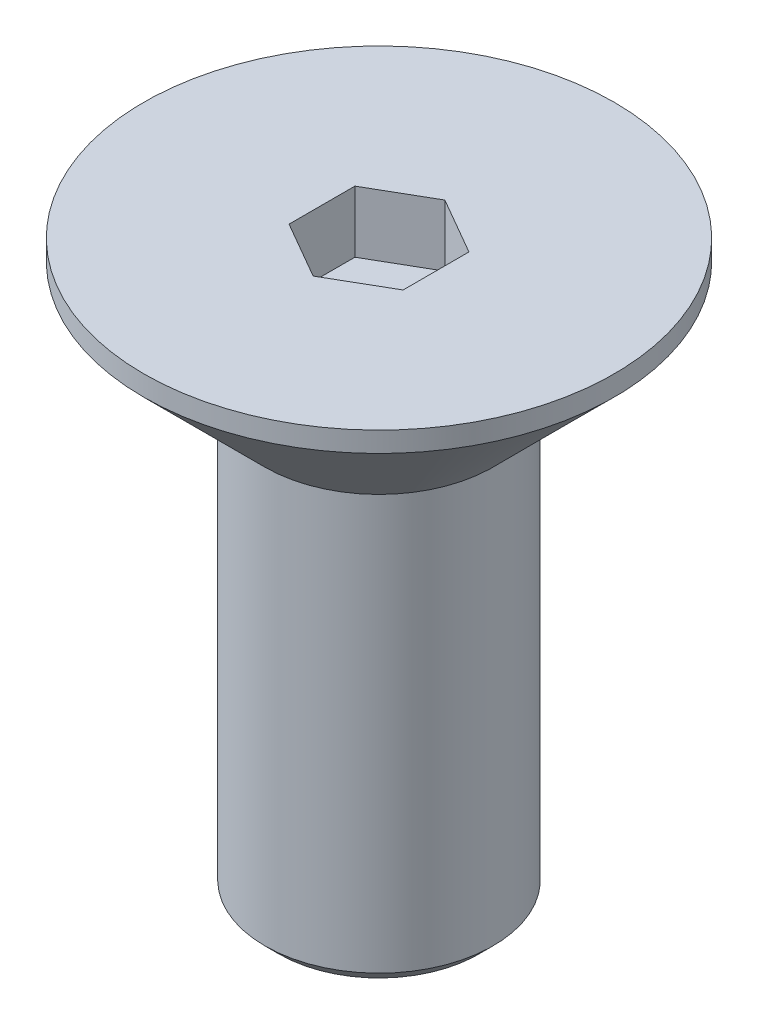
ISO-10303-21;
HEADER;
FILE_DESCRIPTION(('STEP AP214'),'2;1');
FILE_NAME('part.step','',(''),(''),'','','');
FILE_SCHEMA(('AUTOMOTIVE_DESIGN { 1 0 10303 214 1 1 1 1 }'));
ENDSEC;
DATA;
#1=APPLICATION_CONTEXT('core data for automotive mechanical design processes');
#2=APPLICATION_PROTOCOL_DEFINITION('international standard','automotive_design',2000,#1);
#3=PRODUCT_CONTEXT('',#1,'mechanical');
#4=PRODUCT('Part','Part','',(#3));
#5=PRODUCT_RELATED_PRODUCT_CATEGORY('part','',(#4));
#6=PRODUCT_DEFINITION_FORMATION('','',#4);
#7=PRODUCT_DEFINITION_CONTEXT('part definition',#1,'design');
#8=PRODUCT_DEFINITION('design','',#6,#7);
#9=PRODUCT_DEFINITION_SHAPE('','',#8);
#10=(LENGTH_UNIT() NAMED_UNIT(*) SI_UNIT(.MILLI.,.METRE.));
#11=(NAMED_UNIT(*) PLANE_ANGLE_UNIT() SI_UNIT($,.RADIAN.));
#12=(NAMED_UNIT(*) SI_UNIT($,.STERADIAN.) SOLID_ANGLE_UNIT());
#13=UNCERTAINTY_MEASURE_WITH_UNIT(LENGTH_MEASURE(1.E-05),#10,'distance_accuracy_value','');
#14=(GEOMETRIC_REPRESENTATION_CONTEXT(3) GLOBAL_UNCERTAINTY_ASSIGNED_CONTEXT((#13)) GLOBAL_UNIT_ASSIGNED_CONTEXT((#10,
#11,#12)) REPRESENTATION_CONTEXT('',''));
#15=CARTESIAN_POINT('',(0.,0.,0.));
#16=DIRECTION('',(0.,0.,1.));
#17=DIRECTION('',(1.,0.,0.));
#18=AXIS2_PLACEMENT_3D('',#15,#16,#17);
#19=CARTESIAN_POINT('',(0.,0.,0.));
#20=DIRECTION('',(0.,-1.,0.));
#21=DIRECTION('',(0.,0.,-1.));
#22=AXIS2_PLACEMENT_3D('',#19,#20,#21);
#23=PLANE('',#22);
#24=DIRECTION('',(0.,0.,1.));
#25=VECTOR('',#24,1.);
#26=CARTESIAN_POINT('',(-2.,0.,1.15470053837925));
#27=LINE('',#26,#25);
#28=CARTESIAN_POINT('',(-2.,0.,-1.15470053837925));
#29=VERTEX_POINT('',#28);
#30=CARTESIAN_POINT('',(-2.,0.,1.15470053837925));
#31=VERTEX_POINT('',#30);
#32=EDGE_CURVE('E141',#29,#31,#27,.T.);
#33=ORIENTED_EDGE('',*,*,#32,.F.);
#34=DIRECTION('',(-0.866025403784439,0.,0.5));
#35=VECTOR('',#34,1.);
#36=CARTESIAN_POINT('',(-2.,0.,-1.15470053837925));
#37=LINE('',#36,#35);
#38=CARTESIAN_POINT('',(0.,0.,-2.3094010767585));
#39=VERTEX_POINT('',#38);
#40=EDGE_CURVE('E67',#39,#29,#37,.T.);
#41=ORIENTED_EDGE('',*,*,#40,.F.);
#42=DIRECTION('',(-0.866025403784439,0.,-0.5));
#43=VECTOR('',#42,1.);
#44=CARTESIAN_POINT('',(0.,0.,-2.3094010767585));
#45=LINE('',#44,#43);
#46=CARTESIAN_POINT('',(2.,0.,-1.15470053837925));
#47=VERTEX_POINT('',#46);
#48=EDGE_CURVE('E150',#47,#39,#45,.T.);
#49=ORIENTED_EDGE('',*,*,#48,.F.);
#50=DIRECTION('',(0.,0.,-1.));
#51=VECTOR('',#50,1.);
#52=CARTESIAN_POINT('',(2.,0.,-1.15470053837925));
#53=LINE('',#52,#51);
#54=CARTESIAN_POINT('',(2.,0.,1.15470053837925));
#55=VERTEX_POINT('',#54);
#56=EDGE_CURVE('E148',#55,#47,#53,.T.);
#57=ORIENTED_EDGE('',*,*,#56,.F.);
#58=DIRECTION('',(0.866025403784439,0.,-0.5));
#59=VECTOR('',#58,1.);
#60=CARTESIAN_POINT('',(2.,0.,1.15470053837925));
#61=LINE('',#60,#59);
#62=CARTESIAN_POINT('',(0.,0.,2.3094010767585));
#63=VERTEX_POINT('',#62);
#64=EDGE_CURVE('E115',#63,#55,#61,.T.);
#65=ORIENTED_EDGE('',*,*,#64,.F.);
#66=DIRECTION('',(0.866025403784439,0.,0.5));
#67=VECTOR('',#66,1.);
#68=CARTESIAN_POINT('',(0.,0.,2.3094010767585));
#69=LINE('',#68,#67);
#70=EDGE_CURVE('E144',#31,#63,#69,.T.);
#71=ORIENTED_EDGE('',*,*,#70,.F.);
#72=EDGE_LOOP('',(#33,#41,#49,#57,#65,#71));
#73=FACE_BOUND('',#72,.T.);
#74=CARTESIAN_POINT('',(0.,0.,0.));
#75=DIRECTION('',(0.,1.,0.));
#76=DIRECTION('',(0.,0.,1.));
#77=AXIS2_PLACEMENT_3D('',#74,#75,#76);
#78=CIRCLE('',#77,8.25);
#79=CARTESIAN_POINT('',(0.,0.,8.25));
#80=VERTEX_POINT('',#79);
#81=EDGE_CURVE('E165',#80,#80,#78,.T.);
#82=ORIENTED_EDGE('',*,*,#81,.T.);
#83=EDGE_LOOP('',(#82));
#84=FACE_BOUND('',#83,.T.);
#85=ADVANCED_FACE('F51',(#73,#84),#23,.F.);
#86=CARTESIAN_POINT('',(0.,0.,0.));
#87=DIRECTION('',(0.,1.,0.));
#88=DIRECTION('',(0.,0.,1.));
#89=AXIS2_PLACEMENT_3D('',#86,#87,#88);
#90=CYLINDRICAL_SURFACE('',#89,8.25);
#91=ORIENTED_EDGE('',*,*,#81,.F.);
#92=EDGE_LOOP('',(#91));
#93=FACE_BOUND('',#92,.T.);
#94=CARTESIAN_POINT('',(0.,-0.709999999999982,0.));
#95=DIRECTION('',(0.,1.,0.));
#96=DIRECTION('',(0.,0.,1.));
#97=AXIS2_PLACEMENT_3D('',#94,#95,#96);
#98=CIRCLE('',#97,8.25);
#99=CARTESIAN_POINT('',(0.,-0.709999999999982,8.25));
#100=VERTEX_POINT('',#99);
#101=EDGE_CURVE('E162',#100,#100,#98,.T.);
#102=ORIENTED_EDGE('',*,*,#101,.T.);
#103=EDGE_LOOP('',(#102));
#104=FACE_BOUND('',#103,.T.);
#105=ADVANCED_FACE('F183',(#93,#104),#90,.T.);
#106=CARTESIAN_POINT('',(0.,-4.96,0.));
#107=DIRECTION('',(0.,1.,0.));
#108=DIRECTION('',(0.,0.,1.));
#109=AXIS2_PLACEMENT_3D('',#106,#107,#108);
#110=CONICAL_SURFACE('',#109,4.,0.785398163397446);
#111=ORIENTED_EDGE('',*,*,#101,.F.);
#112=EDGE_LOOP('',(#111));
#113=FACE_BOUND('',#112,.T.);
#114=CARTESIAN_POINT('',(0.,-4.96,0.));
#115=DIRECTION('',(0.,1.,0.));
#116=DIRECTION('',(0.,0.,1.));
#117=AXIS2_PLACEMENT_3D('',#114,#115,#116);
#118=CIRCLE('',#117,4.);
#119=CARTESIAN_POINT('',(0.,-4.96,4.));
#120=VERTEX_POINT('',#119);
#121=EDGE_CURVE('E154',#120,#120,#118,.T.);
#122=ORIENTED_EDGE('',*,*,#121,.T.);
#123=EDGE_LOOP('',(#122));
#124=FACE_BOUND('',#123,.T.);
#125=ADVANCED_FACE('F190',(#113,#124),#110,.T.);
#126=CARTESIAN_POINT('',(0.,0.,0.));
#127=DIRECTION('',(0.,1.,0.));
#128=DIRECTION('',(0.,0.,1.));
#129=AXIS2_PLACEMENT_3D('',#126,#127,#128);
#130=CYLINDRICAL_SURFACE('',#129,4.);
#131=CARTESIAN_POINT('',(0.,-19.5,0.));
#132=DIRECTION('',(0.,1.,0.));
#133=DIRECTION('',(0.,0.,1.));
#134=AXIS2_PLACEMENT_3D('',#131,#132,#133);
#135=CIRCLE('',#134,4.);
#136=CARTESIAN_POINT('',(0.,-19.5,4.));
#137=VERTEX_POINT('',#136);
#138=EDGE_CURVE('E60',#137,#137,#135,.T.);
#139=ORIENTED_EDGE('',*,*,#138,.T.);
#140=EDGE_LOOP('',(#139));
#141=FACE_BOUND('',#140,.T.);
#142=ORIENTED_EDGE('',*,*,#121,.F.);
#143=EDGE_LOOP('',(#142));
#144=FACE_BOUND('',#143,.T.);
#145=ADVANCED_FACE('F170',(#141,#144),#130,.T.);
#146=CARTESIAN_POINT('',(4.,-20.,0.));
#147=DIRECTION('',(0.,1.,0.));
#148=DIRECTION('',(0.,0.,1.));
#149=AXIS2_PLACEMENT_3D('',#146,#147,#148);
#150=PLANE('',#149);
#151=CARTESIAN_POINT('',(0.,-20.,0.));
#152=DIRECTION('',(0.,1.,0.));
#153=DIRECTION('',(0.,0.,1.));
#154=AXIS2_PLACEMENT_3D('',#151,#152,#153);
#155=CIRCLE('',#154,3.5);
#156=CARTESIAN_POINT('',(0.,-20.,3.5));
#157=VERTEX_POINT('',#156);
#158=EDGE_CURVE('E11',#157,#157,#155,.F.);
#159=ORIENTED_EDGE('',*,*,#158,.T.);
#160=EDGE_LOOP('',(#159));
#161=FACE_BOUND('',#160,.T.);
#162=ADVANCED_FACE('F200',(#161),#150,.F.);
#163=CARTESIAN_POINT('',(-2.,-2.16,-1.15470053837925));
#164=DIRECTION('',(-0.5,0.,-0.866025403784439));
#165=DIRECTION('',(-0.866025403784439,0.,0.5));
#166=AXIS2_PLACEMENT_3D('',#163,#164,#165);
#167=PLANE('',#166);
#168=ORIENTED_EDGE('',*,*,#40,.T.);
#169=DIRECTION('',(0.,1.,0.));
#170=VECTOR('',#169,1.);
#171=CARTESIAN_POINT('',(-2.,-2.16,-1.15470053837925));
#172=LINE('',#171,#170);
#173=CARTESIAN_POINT('',(-2.,-2.16,-1.15470053837925));
#174=VERTEX_POINT('',#173);
#175=EDGE_CURVE('E97',#174,#29,#172,.T.);
#176=ORIENTED_EDGE('',*,*,#175,.F.);
#177=DIRECTION('',(-0.866025403784439,0.,0.5));
#178=VECTOR('',#177,1.);
#179=CARTESIAN_POINT('',(-2.,-2.16,-1.15470053837925));
#180=LINE('',#179,#178);
#181=CARTESIAN_POINT('',(0.,-2.16,-2.3094010767585));
#182=VERTEX_POINT('',#181);
#183=EDGE_CURVE('E152',#182,#174,#180,.T.);
#184=ORIENTED_EDGE('',*,*,#183,.F.);
#185=DIRECTION('',(0.,1.,0.));
#186=VECTOR('',#185,1.);
#187=CARTESIAN_POINT('',(0.,-2.16,-2.3094010767585));
#188=LINE('',#187,#186);
#189=EDGE_CURVE('E75',#182,#39,#188,.T.);
#190=ORIENTED_EDGE('',*,*,#189,.T.);
#191=EDGE_LOOP('',(#168,#176,#184,#190));
#192=FACE_BOUND('',#191,.T.);
#193=ADVANCED_FACE('F202',(#192),#167,.F.);
#194=CARTESIAN_POINT('',(0.,-2.16,-2.3094010767585));
#195=DIRECTION('',(0.5,0.,-0.866025403784439));
#196=DIRECTION('',(-0.866025403784439,0.,-0.5));
#197=AXIS2_PLACEMENT_3D('',#194,#195,#196);
#198=PLANE('',#197);
#199=ORIENTED_EDGE('',*,*,#48,.T.);
#200=ORIENTED_EDGE('',*,*,#189,.F.);
#201=DIRECTION('',(-0.866025403784439,0.,-0.5));
#202=VECTOR('',#201,1.);
#203=CARTESIAN_POINT('',(0.,-2.16,-2.3094010767585));
#204=LINE('',#203,#202);
#205=CARTESIAN_POINT('',(2.,-2.16,-1.15470053837925));
#206=VERTEX_POINT('',#205);
#207=EDGE_CURVE('E127',#206,#182,#204,.T.);
#208=ORIENTED_EDGE('',*,*,#207,.F.);
#209=DIRECTION('',(0.,1.,0.));
#210=VECTOR('',#209,1.);
#211=CARTESIAN_POINT('',(2.,-2.16,-1.15470053837925));
#212=LINE('',#211,#210);
#213=EDGE_CURVE('E119',#206,#47,#212,.T.);
#214=ORIENTED_EDGE('',*,*,#213,.T.);
#215=EDGE_LOOP('',(#199,#200,#208,#214));
#216=FACE_BOUND('',#215,.T.);
#217=ADVANCED_FACE('F205',(#216),#198,.F.);
#218=CARTESIAN_POINT('',(2.,-2.16,-1.15470053837925));
#219=DIRECTION('',(1.,0.,0.));
#220=DIRECTION('',(0.,0.,-1.));
#221=AXIS2_PLACEMENT_3D('',#218,#219,#220);
#222=PLANE('',#221);
#223=ORIENTED_EDGE('',*,*,#56,.T.);
#224=ORIENTED_EDGE('',*,*,#213,.F.);
#225=DIRECTION('',(0.,0.,-1.));
#226=VECTOR('',#225,1.);
#227=CARTESIAN_POINT('',(2.,-2.16,-1.15470053837925));
#228=LINE('',#227,#226);
#229=CARTESIAN_POINT('',(2.,-2.16,1.15470053837925));
#230=VERTEX_POINT('',#229);
#231=EDGE_CURVE('E123',#230,#206,#228,.T.);
#232=ORIENTED_EDGE('',*,*,#231,.F.);
#233=DIRECTION('',(0.,1.,0.));
#234=VECTOR('',#233,1.);
#235=CARTESIAN_POINT('',(2.,-2.16,1.15470053837925));
#236=LINE('',#235,#234);
#237=EDGE_CURVE('E108',#230,#55,#236,.T.);
#238=ORIENTED_EDGE('',*,*,#237,.T.);
#239=EDGE_LOOP('',(#223,#224,#232,#238));
#240=FACE_BOUND('',#239,.T.);
#241=ADVANCED_FACE('F124',(#240),#222,.F.);
#242=CARTESIAN_POINT('',(2.,-2.16,1.15470053837925));
#243=DIRECTION('',(0.5,0.,0.866025403784439));
#244=DIRECTION('',(0.866025403784439,0.,-0.5));
#245=AXIS2_PLACEMENT_3D('',#242,#243,#244);
#246=PLANE('',#245);
#247=ORIENTED_EDGE('',*,*,#64,.T.);
#248=ORIENTED_EDGE('',*,*,#237,.F.);
#249=DIRECTION('',(0.866025403784439,0.,-0.5));
#250=VECTOR('',#249,1.);
#251=CARTESIAN_POINT('',(2.,-2.16,1.15470053837925));
#252=LINE('',#251,#250);
#253=CARTESIAN_POINT('',(0.,-2.16,2.3094010767585));
#254=VERTEX_POINT('',#253);
#255=EDGE_CURVE('E112',#254,#230,#252,.T.);
#256=ORIENTED_EDGE('',*,*,#255,.F.);
#257=DIRECTION('',(0.,1.,0.));
#258=VECTOR('',#257,1.);
#259=CARTESIAN_POINT('',(0.,-2.16,2.3094010767585));
#260=LINE('',#259,#258);
#261=EDGE_CURVE('E120',#254,#63,#260,.T.);
#262=ORIENTED_EDGE('',*,*,#261,.T.);
#263=EDGE_LOOP('',(#247,#248,#256,#262));
#264=FACE_BOUND('',#263,.T.);
#265=ADVANCED_FACE('F110',(#264),#246,.F.);
#266=CARTESIAN_POINT('',(0.,-2.16,2.3094010767585));
#267=DIRECTION('',(-0.5,0.,0.866025403784439));
#268=DIRECTION('',(0.866025403784439,0.,0.5));
#269=AXIS2_PLACEMENT_3D('',#266,#267,#268);
#270=PLANE('',#269);
#271=ORIENTED_EDGE('',*,*,#70,.T.);
#272=ORIENTED_EDGE('',*,*,#261,.F.);
#273=DIRECTION('',(0.866025403784439,0.,0.5));
#274=VECTOR('',#273,1.);
#275=CARTESIAN_POINT('',(0.,-2.16,2.3094010767585));
#276=LINE('',#275,#274);
#277=CARTESIAN_POINT('',(-2.,-2.16,1.15470053837925));
#278=VERTEX_POINT('',#277);
#279=EDGE_CURVE('E133',#278,#254,#276,.T.);
#280=ORIENTED_EDGE('',*,*,#279,.F.);
#281=DIRECTION('',(0.,1.,0.));
#282=VECTOR('',#281,1.);
#283=CARTESIAN_POINT('',(-2.,-2.16,1.15470053837925));
#284=LINE('',#283,#282);
#285=EDGE_CURVE('E157',#278,#31,#284,.T.);
#286=ORIENTED_EDGE('',*,*,#285,.T.);
#287=EDGE_LOOP('',(#271,#272,#280,#286));
#288=FACE_BOUND('',#287,.T.);
#289=ADVANCED_FACE('F208',(#288),#270,.F.);
#290=CARTESIAN_POINT('',(-2.,-2.16,1.15470053837925));
#291=DIRECTION('',(-1.,0.,0.));
#292=DIRECTION('',(0.,0.,1.));
#293=AXIS2_PLACEMENT_3D('',#290,#291,#292);
#294=PLANE('',#293);
#295=ORIENTED_EDGE('',*,*,#32,.T.);
#296=ORIENTED_EDGE('',*,*,#285,.F.);
#297=DIRECTION('',(0.,0.,1.));
#298=VECTOR('',#297,1.);
#299=CARTESIAN_POINT('',(-2.,-2.16,1.15470053837925));
#300=LINE('',#299,#298);
#301=EDGE_CURVE('E135',#174,#278,#300,.T.);
#302=ORIENTED_EDGE('',*,*,#301,.F.);
#303=ORIENTED_EDGE('',*,*,#175,.T.);
#304=EDGE_LOOP('',(#295,#296,#302,#303));
#305=FACE_BOUND('',#304,.T.);
#306=ADVANCED_FACE('F179',(#305),#294,.F.);
#307=CARTESIAN_POINT('',(0.,-2.16,0.));
#308=DIRECTION('',(0.,-1.,0.));
#309=DIRECTION('',(0.,0.,-1.));
#310=AXIS2_PLACEMENT_3D('',#307,#308,#309);
#311=PLANE('',#310);
#312=ORIENTED_EDGE('',*,*,#183,.T.);
#313=ORIENTED_EDGE('',*,*,#301,.T.);
#314=ORIENTED_EDGE('',*,*,#279,.T.);
#315=ORIENTED_EDGE('',*,*,#255,.T.);
#316=ORIENTED_EDGE('',*,*,#231,.T.);
#317=ORIENTED_EDGE('',*,*,#207,.T.);
#318=EDGE_LOOP('',(#312,#313,#314,#315,#316,#317));
#319=FACE_BOUND('',#318,.T.);
#320=ADVANCED_FACE('F130',(#319),#311,.F.);
#321=CARTESIAN_POINT('',(0.,-19.5,0.));
#322=DIRECTION('',(0.,1.,0.));
#323=DIRECTION('',(0.,0.,1.));
#324=AXIS2_PLACEMENT_3D('',#321,#322,#323);
#325=CONICAL_SURFACE('',#324,4.,0.785398163397449);
#326=ORIENTED_EDGE('',*,*,#158,.F.);
#327=EDGE_LOOP('',(#326));
#328=FACE_BOUND('',#327,.T.);
#329=ORIENTED_EDGE('',*,*,#138,.F.);
#330=EDGE_LOOP('',(#329));
#331=FACE_BOUND('',#330,.T.);
#332=ADVANCED_FACE('F54',(#328,#331),#325,.T.);
#333=CLOSED_SHELL('',(#85,#105,#125,#145,#162,#193,#217,#241,#265,#289,#306,#320,#332));
#334=MANIFOLD_SOLID_BREP('B2',#333);
#335=ADVANCED_BREP_SHAPE_REPRESENTATION('',(#18,#334),#14);
#336=SHAPE_DEFINITION_REPRESENTATION(#9,#335);
ENDSEC;
END-ISO-10303-21;
